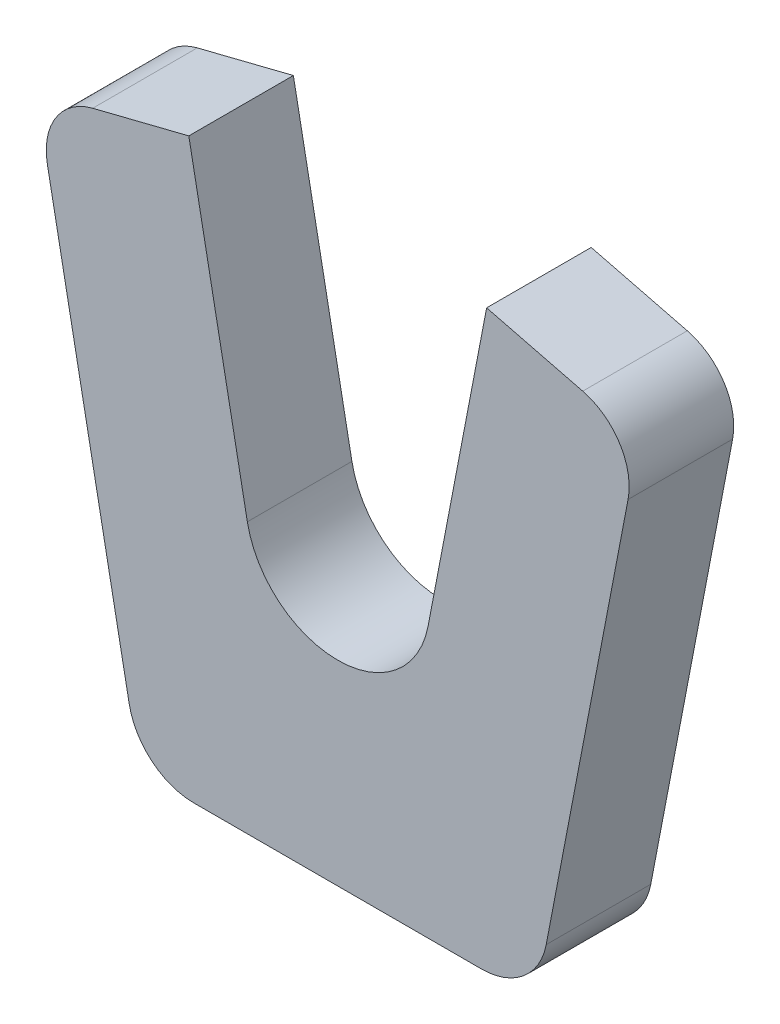
ISO-10303-21;
HEADER;
FILE_DESCRIPTION(('STEP AP214'),'2;1');
FILE_NAME('part.step','',(''),(''),'','','');
FILE_SCHEMA(('AUTOMOTIVE_DESIGN { 1 0 10303 214 1 1 1 1 }'));
ENDSEC;
DATA;
#1=APPLICATION_CONTEXT('core data for automotive mechanical design processes');
#2=APPLICATION_PROTOCOL_DEFINITION('international standard','automotive_design',2000,#1);
#3=PRODUCT_CONTEXT('',#1,'mechanical');
#4=PRODUCT('Part','Part','',(#3));
#5=PRODUCT_RELATED_PRODUCT_CATEGORY('part','',(#4));
#6=PRODUCT_DEFINITION_FORMATION('','',#4);
#7=PRODUCT_DEFINITION_CONTEXT('part definition',#1,'design');
#8=PRODUCT_DEFINITION('design','',#6,#7);
#9=PRODUCT_DEFINITION_SHAPE('','',#8);
#10=(LENGTH_UNIT() NAMED_UNIT(*) SI_UNIT(.MILLI.,.METRE.));
#11=(NAMED_UNIT(*) PLANE_ANGLE_UNIT() SI_UNIT($,.RADIAN.));
#12=(NAMED_UNIT(*) SI_UNIT($,.STERADIAN.) SOLID_ANGLE_UNIT());
#13=UNCERTAINTY_MEASURE_WITH_UNIT(LENGTH_MEASURE(1.E-05),#10,'distance_accuracy_value','');
#14=(GEOMETRIC_REPRESENTATION_CONTEXT(3) GLOBAL_UNCERTAINTY_ASSIGNED_CONTEXT((#13)) GLOBAL_UNIT_ASSIGNED_CONTEXT((#10,
#11,#12)) REPRESENTATION_CONTEXT('',''));
#15=CARTESIAN_POINT('',(0.,0.,0.));
#16=DIRECTION('',(0.,0.,1.));
#17=DIRECTION('',(1.,0.,0.));
#18=AXIS2_PLACEMENT_3D('',#15,#16,#17);
#19=CARTESIAN_POINT('',(13.75,6.3,10.));
#20=DIRECTION('',(0.,0.,-1.));
#21=DIRECTION('',(-1.,0.,0.));
#22=AXIS2_PLACEMENT_3D('',#19,#20,#21);
#23=CYLINDRICAL_SURFACE('',#22,6.3);
#24=CARTESIAN_POINT('',(13.75,6.3,0.));
#25=DIRECTION('',(0.,0.,1.));
#26=DIRECTION('',(1.,0.,0.));
#27=AXIS2_PLACEMENT_3D('',#24,#25,#26);
#28=CIRCLE('',#27,6.3);
#29=CARTESIAN_POINT('',(13.75,0.,0.));
#30=VERTEX_POINT('',#29);
#31=CARTESIAN_POINT('',(19.937041963821,5.1123503303084,0.));
#32=VERTEX_POINT('',#31);
#33=EDGE_CURVE('E156',#30,#32,#28,.T.);
#34=ORIENTED_EDGE('',*,*,#33,.T.);
#35=DIRECTION('',(0.,0.,-1.));
#36=VECTOR('',#35,1.);
#37=CARTESIAN_POINT('',(19.937041963821,5.1123503303084,10.));
#38=LINE('',#37,#36);
#39=CARTESIAN_POINT('',(19.937041963821,5.1123503303084,10.));
#40=VERTEX_POINT('',#39);
#41=EDGE_CURVE('E11',#40,#32,#38,.T.);
#42=ORIENTED_EDGE('',*,*,#41,.F.);
#43=CARTESIAN_POINT('',(13.75,6.3,10.));
#44=DIRECTION('',(0.,0.,1.));
#45=DIRECTION('',(1.,0.,0.));
#46=AXIS2_PLACEMENT_3D('',#43,#44,#45);
#47=CIRCLE('',#46,6.3);
#48=CARTESIAN_POINT('',(13.75,0.,10.));
#49=VERTEX_POINT('',#48);
#50=EDGE_CURVE('E178',#49,#40,#47,.T.);
#51=ORIENTED_EDGE('',*,*,#50,.F.);
#52=DIRECTION('',(0.,0.,-1.));
#53=VECTOR('',#52,1.);
#54=CARTESIAN_POINT('',(13.75,0.,10.));
#55=LINE('',#54,#53);
#56=EDGE_CURVE('E152',#49,#30,#55,.T.);
#57=ORIENTED_EDGE('',*,*,#56,.T.);
#58=EDGE_LOOP('',(#34,#42,#51,#57));
#59=FACE_BOUND('',#58,.T.);
#60=ADVANCED_FACE('F36',(#59),#23,.T.);
#61=CARTESIAN_POINT('',(19.937041963821,5.1123503303084,10.));
#62=DIRECTION('',(-0.982070152987453,0.188515820585968,0.));
#63=DIRECTION('',(-0.188515820585968,-0.982070152987453,0.));
#64=AXIS2_PLACEMENT_3D('',#61,#62,#63);
#65=PLANE('',#64);
#66=DIRECTION('',(0.188515820585968,0.982070152987453,0.));
#67=VECTOR('',#66,1.);
#68=CARTESIAN_POINT('',(19.937041963821,5.1123503303084,0.));
#69=LINE('',#68,#67);
#70=CARTESIAN_POINT('',(27.7652576974344,45.8933150219307,0.));
#71=VERTEX_POINT('',#70);
#72=EDGE_CURVE('E159',#32,#71,#69,.T.);
#73=ORIENTED_EDGE('',*,*,#72,.T.);
#74=DIRECTION('',(0.,0.,-1.));
#75=VECTOR('',#74,1.);
#76=CARTESIAN_POINT('',(27.7652576974344,45.8933150219307,10.));
#77=LINE('',#76,#75);
#78=CARTESIAN_POINT('',(27.7652576974344,45.8933150219307,10.));
#79=VERTEX_POINT('',#78);
#80=EDGE_CURVE('E44',#79,#71,#77,.T.);
#81=ORIENTED_EDGE('',*,*,#80,.F.);
#82=DIRECTION('',(0.188515820585968,0.982070152987453,0.));
#83=VECTOR('',#82,1.);
#84=CARTESIAN_POINT('',(19.937041963821,5.1123503303084,10.));
#85=LINE('',#84,#83);
#86=EDGE_CURVE('E107',#40,#79,#85,.T.);
#87=ORIENTED_EDGE('',*,*,#86,.F.);
#88=ORIENTED_EDGE('',*,*,#41,.T.);
#89=EDGE_LOOP('',(#73,#81,#87,#88));
#90=FACE_BOUND('',#89,.T.);
#91=ADVANCED_FACE('F256',(#90),#65,.F.);
#92=CARTESIAN_POINT('',(22.,47.,10.));
#93=DIRECTION('',(0.,0.,-1.));
#94=DIRECTION('',(-1.,0.,0.));
#95=AXIS2_PLACEMENT_3D('',#92,#93,#94);
#96=CYLINDRICAL_SURFACE('',#95,5.8705151357024);
#97=CARTESIAN_POINT('',(22.,47.,0.));
#98=DIRECTION('',(0.,0.,1.));
#99=DIRECTION('',(1.,0.,0.));
#100=AXIS2_PLACEMENT_3D('',#97,#98,#99);
#101=CIRCLE('',#100,5.8705151357024);
#102=CARTESIAN_POINT('',(23.4288752277412,52.6939672937293,0.));
#103=VERTEX_POINT('',#102);
#104=EDGE_CURVE('E161',#71,#103,#101,.T.);
#105=ORIENTED_EDGE('',*,*,#104,.T.);
#106=DIRECTION('',(0.,0.,-1.));
#107=VECTOR('',#106,1.);
#108=CARTESIAN_POINT('',(23.4288752277412,52.6939672937293,10.));
#109=LINE('',#108,#107);
#110=CARTESIAN_POINT('',(23.4288752277412,52.6939672937293,10.));
#111=VERTEX_POINT('',#110);
#112=EDGE_CURVE('E197',#111,#103,#109,.T.);
#113=ORIENTED_EDGE('',*,*,#112,.F.);
#114=CARTESIAN_POINT('',(22.,47.,10.));
#115=DIRECTION('',(0.,0.,1.));
#116=DIRECTION('',(1.,0.,0.));
#117=AXIS2_PLACEMENT_3D('',#114,#115,#116);
#118=CIRCLE('',#117,5.8705151357024);
#119=EDGE_CURVE('E205',#79,#111,#118,.T.);
#120=ORIENTED_EDGE('',*,*,#119,.F.);
#121=ORIENTED_EDGE('',*,*,#80,.T.);
#122=EDGE_LOOP('',(#105,#113,#120,#121));
#123=FACE_BOUND('',#122,.T.);
#124=ADVANCED_FACE('F203',(#123),#96,.T.);
#125=CARTESIAN_POINT('',(23.4288752277412,52.6939672937293,10.));
#126=DIRECTION('',(-0.243398610634918,-0.969926345833018,0.));
#127=DIRECTION('',(0.969926345833018,-0.243398610634918,0.));
#128=AXIS2_PLACEMENT_3D('',#125,#126,#127);
#129=PLANE('',#128);
#130=DIRECTION('',(-0.969926345833018,0.243398610634918,0.));
#131=VECTOR('',#130,1.);
#132=CARTESIAN_POINT('',(23.4288752277412,52.6939672937293,0.));
#133=LINE('',#132,#131);
#134=CARTESIAN_POINT('',(14.2394970701169,55.,0.));
#135=VERTEX_POINT('',#134);
#136=EDGE_CURVE('E163',#103,#135,#133,.T.);
#137=ORIENTED_EDGE('',*,*,#136,.T.);
#138=DIRECTION('',(0.,0.,-1.));
#139=VECTOR('',#138,1.);
#140=CARTESIAN_POINT('',(14.2394970701169,55.,10.));
#141=LINE('',#140,#139);
#142=CARTESIAN_POINT('',(14.2394970701169,55.,10.));
#143=VERTEX_POINT('',#142);
#144=EDGE_CURVE('E194',#143,#135,#141,.T.);
#145=ORIENTED_EDGE('',*,*,#144,.F.);
#146=DIRECTION('',(-0.969926345833018,0.243398610634918,0.));
#147=VECTOR('',#146,1.);
#148=CARTESIAN_POINT('',(23.4288752277412,52.6939672937293,10.));
#149=LINE('',#148,#147);
#150=EDGE_CURVE('E223',#111,#143,#149,.T.);
#151=ORIENTED_EDGE('',*,*,#150,.F.);
#152=ORIENTED_EDGE('',*,*,#112,.T.);
#153=EDGE_LOOP('',(#137,#145,#151,#152));
#154=FACE_BOUND('',#153,.T.);
#155=ADVANCED_FACE('F214',(#154),#129,.F.);
#156=CARTESIAN_POINT('',(14.2394970701169,55.,10.));
#157=DIRECTION('',(0.982070152987453,-0.188515820585968,0.));
#158=DIRECTION('',(0.188515820585968,0.982070152987453,0.));
#159=AXIS2_PLACEMENT_3D('',#156,#157,#158);
#160=PLANE('',#159);
#161=DIRECTION('',(-0.188515820585968,-0.982070152987453,0.));
#162=VECTOR('',#161,1.);
#163=CARTESIAN_POINT('',(14.2394970701169,55.,0.));
#164=LINE('',#163,#162);
#165=CARTESIAN_POINT('',(8.64221734628958,25.8410607788435,0.));
#166=VERTEX_POINT('',#165);
#167=EDGE_CURVE('E165',#135,#166,#164,.T.);
#168=ORIENTED_EDGE('',*,*,#167,.T.);
#169=DIRECTION('',(0.,0.,-1.));
#170=VECTOR('',#169,1.);
#171=CARTESIAN_POINT('',(8.64221734628958,25.8410607788435,10.));
#172=LINE('',#171,#170);
#173=CARTESIAN_POINT('',(8.64221734628958,25.8410607788435,10.));
#174=VERTEX_POINT('',#173);
#175=EDGE_CURVE('E191',#174,#166,#172,.T.);
#176=ORIENTED_EDGE('',*,*,#175,.F.);
#177=DIRECTION('',(-0.188515820585968,-0.982070152987453,0.));
#178=VECTOR('',#177,1.);
#179=CARTESIAN_POINT('',(14.2394970701169,55.,10.));
#180=LINE('',#179,#178);
#181=EDGE_CURVE('E220',#143,#174,#180,.T.);
#182=ORIENTED_EDGE('',*,*,#181,.F.);
#183=ORIENTED_EDGE('',*,*,#144,.T.);
#184=EDGE_LOOP('',(#168,#176,#182,#183));
#185=FACE_BOUND('',#184,.T.);
#186=ADVANCED_FACE('F218',(#185),#160,.F.);
#187=CARTESIAN_POINT('',(0.,27.5,10.));
#188=DIRECTION('',(0.,0.,-1.));
#189=DIRECTION('',(-1.,0.,0.));
#190=AXIS2_PLACEMENT_3D('',#187,#188,#189);
#191=CYLINDRICAL_SURFACE('',#190,8.8);
#192=CARTESIAN_POINT('',(0.,27.5,0.));
#193=DIRECTION('',(0.,0.,-1.));
#194=DIRECTION('',(1.,0.,0.));
#195=AXIS2_PLACEMENT_3D('',#192,#193,#194);
#196=CIRCLE('',#195,8.8);
#197=CARTESIAN_POINT('',(-8.64221734628958,25.8410607788435,0.));
#198=VERTEX_POINT('',#197);
#199=EDGE_CURVE('E167',#166,#198,#196,.T.);
#200=ORIENTED_EDGE('',*,*,#199,.T.);
#201=DIRECTION('',(0.,0.,-1.));
#202=VECTOR('',#201,1.);
#203=CARTESIAN_POINT('',(-8.64221734628958,25.8410607788435,10.));
#204=LINE('',#203,#202);
#205=CARTESIAN_POINT('',(-8.64221734628958,25.8410607788435,10.));
#206=VERTEX_POINT('',#205);
#207=EDGE_CURVE('E188',#206,#198,#204,.T.);
#208=ORIENTED_EDGE('',*,*,#207,.F.);
#209=CARTESIAN_POINT('',(0.,27.5,10.));
#210=DIRECTION('',(0.,0.,-1.));
#211=DIRECTION('',(1.,0.,0.));
#212=AXIS2_PLACEMENT_3D('',#209,#210,#211);
#213=CIRCLE('',#212,8.8);
#214=EDGE_CURVE('E222',#174,#206,#213,.T.);
#215=ORIENTED_EDGE('',*,*,#214,.F.);
#216=ORIENTED_EDGE('',*,*,#175,.T.);
#217=EDGE_LOOP('',(#200,#208,#215,#216));
#218=FACE_BOUND('',#217,.T.);
#219=ADVANCED_FACE('F269',(#218),#191,.F.);
#220=CARTESIAN_POINT('',(-14.2394970701169,55.,10.));
#221=DIRECTION('',(-0.982070152987453,-0.188515820585968,0.));
#222=DIRECTION('',(0.188515820585968,-0.982070152987453,0.));
#223=AXIS2_PLACEMENT_3D('',#220,#221,#222);
#224=PLANE('',#223);
#225=DIRECTION('',(-0.188515820585968,0.982070152987453,0.));
#226=VECTOR('',#225,1.);
#227=CARTESIAN_POINT('',(-14.2394970701169,55.,0.));
#228=LINE('',#227,#226);
#229=CARTESIAN_POINT('',(-14.2394970701169,55.,0.));
#230=VERTEX_POINT('',#229);
#231=EDGE_CURVE('E169',#198,#230,#228,.T.);
#232=ORIENTED_EDGE('',*,*,#231,.T.);
#233=DIRECTION('',(0.,0.,-1.));
#234=VECTOR('',#233,1.);
#235=CARTESIAN_POINT('',(-14.2394970701169,55.,10.));
#236=LINE('',#235,#234);
#237=CARTESIAN_POINT('',(-14.2394970701169,55.,10.));
#238=VERTEX_POINT('',#237);
#239=EDGE_CURVE('E185',#238,#230,#236,.T.);
#240=ORIENTED_EDGE('',*,*,#239,.F.);
#241=DIRECTION('',(-0.188515820585968,0.982070152987453,0.));
#242=VECTOR('',#241,1.);
#243=CARTESIAN_POINT('',(-14.2394970701169,55.,10.));
#244=LINE('',#243,#242);
#245=EDGE_CURVE('E225',#206,#238,#244,.T.);
#246=ORIENTED_EDGE('',*,*,#245,.F.);
#247=ORIENTED_EDGE('',*,*,#207,.T.);
#248=EDGE_LOOP('',(#232,#240,#246,#247));
#249=FACE_BOUND('',#248,.T.);
#250=ADVANCED_FACE('F272',(#249),#224,.F.);
#251=CARTESIAN_POINT('',(-23.4288752277412,52.6939672937293,10.));
#252=DIRECTION('',(0.243398610634918,-0.969926345833018,0.));
#253=DIRECTION('',(0.969926345833018,0.243398610634918,0.));
#254=AXIS2_PLACEMENT_3D('',#251,#252,#253);
#255=PLANE('',#254);
#256=DIRECTION('',(-0.969926345833018,-0.243398610634918,0.));
#257=VECTOR('',#256,1.);
#258=CARTESIAN_POINT('',(-23.4288752277412,52.6939672937293,0.));
#259=LINE('',#258,#257);
#260=CARTESIAN_POINT('',(-23.4288752277412,52.6939672937293,0.));
#261=VERTEX_POINT('',#260);
#262=EDGE_CURVE('E171',#230,#261,#259,.T.);
#263=ORIENTED_EDGE('',*,*,#262,.T.);
#264=DIRECTION('',(0.,0.,-1.));
#265=VECTOR('',#264,1.);
#266=CARTESIAN_POINT('',(-23.4288752277412,52.6939672937293,10.));
#267=LINE('',#266,#265);
#268=CARTESIAN_POINT('',(-23.4288752277412,52.6939672937293,10.));
#269=VERTEX_POINT('',#268);
#270=EDGE_CURVE('E182',#269,#261,#267,.T.);
#271=ORIENTED_EDGE('',*,*,#270,.F.);
#272=DIRECTION('',(-0.969926345833018,-0.243398610634918,0.));
#273=VECTOR('',#272,1.);
#274=CARTESIAN_POINT('',(-23.4288752277412,52.6939672937293,10.));
#275=LINE('',#274,#273);
#276=EDGE_CURVE('E231',#238,#269,#275,.T.);
#277=ORIENTED_EDGE('',*,*,#276,.F.);
#278=ORIENTED_EDGE('',*,*,#239,.T.);
#279=EDGE_LOOP('',(#263,#271,#277,#278));
#280=FACE_BOUND('',#279,.T.);
#281=ADVANCED_FACE('F237',(#280),#255,.F.);
#282=CARTESIAN_POINT('',(-22.,47.,10.));
#283=DIRECTION('',(0.,0.,-1.));
#284=DIRECTION('',(-1.,0.,0.));
#285=AXIS2_PLACEMENT_3D('',#282,#283,#284);
#286=CYLINDRICAL_SURFACE('',#285,5.8705151357024);
#287=CARTESIAN_POINT('',(-22.,47.,0.));
#288=DIRECTION('',(0.,0.,1.));
#289=DIRECTION('',(-1.,0.,0.));
#290=AXIS2_PLACEMENT_3D('',#287,#288,#289);
#291=CIRCLE('',#290,5.8705151357024);
#292=CARTESIAN_POINT('',(-27.7652576974344,45.8933150219307,0.));
#293=VERTEX_POINT('',#292);
#294=EDGE_CURVE('E173',#261,#293,#291,.T.);
#295=ORIENTED_EDGE('',*,*,#294,.T.);
#296=DIRECTION('',(0.,0.,-1.));
#297=VECTOR('',#296,1.);
#298=CARTESIAN_POINT('',(-27.7652576974344,45.8933150219307,10.));
#299=LINE('',#298,#297);
#300=CARTESIAN_POINT('',(-27.7652576974344,45.8933150219307,10.));
#301=VERTEX_POINT('',#300);
#302=EDGE_CURVE('E147',#301,#293,#299,.T.);
#303=ORIENTED_EDGE('',*,*,#302,.F.);
#304=CARTESIAN_POINT('',(-22.,47.,10.));
#305=DIRECTION('',(0.,0.,1.));
#306=DIRECTION('',(-1.,0.,0.));
#307=AXIS2_PLACEMENT_3D('',#304,#305,#306);
#308=CIRCLE('',#307,5.8705151357024);
#309=EDGE_CURVE('E138',#269,#301,#308,.T.);
#310=ORIENTED_EDGE('',*,*,#309,.F.);
#311=ORIENTED_EDGE('',*,*,#270,.T.);
#312=EDGE_LOOP('',(#295,#303,#310,#311));
#313=FACE_BOUND('',#312,.T.);
#314=ADVANCED_FACE('F241',(#313),#286,.T.);
#315=CARTESIAN_POINT('',(-19.937041963821,5.1123503303084,10.));
#316=DIRECTION('',(0.982070152987453,0.188515820585968,0.));
#317=DIRECTION('',(-0.188515820585968,0.982070152987453,0.));
#318=AXIS2_PLACEMENT_3D('',#315,#316,#317);
#319=PLANE('',#318);
#320=DIRECTION('',(0.188515820585968,-0.982070152987453,0.));
#321=VECTOR('',#320,1.);
#322=CARTESIAN_POINT('',(-19.937041963821,5.1123503303084,0.));
#323=LINE('',#322,#321);
#324=CARTESIAN_POINT('',(-19.937041963821,5.1123503303084,0.));
#325=VERTEX_POINT('',#324);
#326=EDGE_CURVE('E146',#293,#325,#323,.T.);
#327=ORIENTED_EDGE('',*,*,#326,.T.);
#328=DIRECTION('',(0.,0.,-1.));
#329=VECTOR('',#328,1.);
#330=CARTESIAN_POINT('',(-19.937041963821,5.1123503303084,10.));
#331=LINE('',#330,#329);
#332=CARTESIAN_POINT('',(-19.937041963821,5.1123503303084,10.));
#333=VERTEX_POINT('',#332);
#334=EDGE_CURVE('E143',#333,#325,#331,.T.);
#335=ORIENTED_EDGE('',*,*,#334,.F.);
#336=DIRECTION('',(0.188515820585968,-0.982070152987453,0.));
#337=VECTOR('',#336,1.);
#338=CARTESIAN_POINT('',(-19.937041963821,5.1123503303084,10.));
#339=LINE('',#338,#337);
#340=EDGE_CURVE('E132',#301,#333,#339,.T.);
#341=ORIENTED_EDGE('',*,*,#340,.F.);
#342=ORIENTED_EDGE('',*,*,#302,.T.);
#343=EDGE_LOOP('',(#327,#335,#341,#342));
#344=FACE_BOUND('',#343,.T.);
#345=ADVANCED_FACE('F144',(#344),#319,.F.);
#346=CARTESIAN_POINT('',(-13.75,6.3,10.));
#347=DIRECTION('',(0.,0.,-1.));
#348=DIRECTION('',(-1.,0.,0.));
#349=AXIS2_PLACEMENT_3D('',#346,#347,#348);
#350=CYLINDRICAL_SURFACE('',#349,6.3);
#351=CARTESIAN_POINT('',(-13.75,6.3,0.));
#352=DIRECTION('',(0.,0.,1.));
#353=DIRECTION('',(-1.,0.,0.));
#354=AXIS2_PLACEMENT_3D('',#351,#352,#353);
#355=CIRCLE('',#354,6.3);
#356=CARTESIAN_POINT('',(-13.75,0.,0.));
#357=VERTEX_POINT('',#356);
#358=EDGE_CURVE('E93',#325,#357,#355,.T.);
#359=ORIENTED_EDGE('',*,*,#358,.T.);
#360=DIRECTION('',(0.,0.,-1.));
#361=VECTOR('',#360,1.);
#362=CARTESIAN_POINT('',(-13.75,0.,10.));
#363=LINE('',#362,#361);
#364=CARTESIAN_POINT('',(-13.75,0.,10.));
#365=VERTEX_POINT('',#364);
#366=EDGE_CURVE('E148',#365,#357,#363,.T.);
#367=ORIENTED_EDGE('',*,*,#366,.F.);
#368=CARTESIAN_POINT('',(-13.75,6.3,10.));
#369=DIRECTION('',(0.,0.,1.));
#370=DIRECTION('',(-1.,0.,0.));
#371=AXIS2_PLACEMENT_3D('',#368,#369,#370);
#372=CIRCLE('',#371,6.3);
#373=EDGE_CURVE('E136',#333,#365,#372,.T.);
#374=ORIENTED_EDGE('',*,*,#373,.F.);
#375=ORIENTED_EDGE('',*,*,#334,.T.);
#376=EDGE_LOOP('',(#359,#367,#374,#375));
#377=FACE_BOUND('',#376,.T.);
#378=ADVANCED_FACE('F150',(#377),#350,.T.);
#379=CARTESIAN_POINT('',(-13.75,0.,10.));
#380=DIRECTION('',(0.,1.,0.));
#381=DIRECTION('',(0.,0.,1.));
#382=AXIS2_PLACEMENT_3D('',#379,#380,#381);
#383=PLANE('',#382);
#384=DIRECTION('',(1.,0.,0.));
#385=VECTOR('',#384,1.);
#386=CARTESIAN_POINT('',(-13.75,0.,0.));
#387=LINE('',#386,#385);
#388=EDGE_CURVE('E99',#357,#30,#387,.T.);
#389=ORIENTED_EDGE('',*,*,#388,.T.);
#390=ORIENTED_EDGE('',*,*,#56,.F.);
#391=DIRECTION('',(1.,0.,0.));
#392=VECTOR('',#391,1.);
#393=CARTESIAN_POINT('',(-13.75,0.,10.));
#394=LINE('',#393,#392);
#395=EDGE_CURVE('E52',#365,#49,#394,.T.);
#396=ORIENTED_EDGE('',*,*,#395,.F.);
#397=ORIENTED_EDGE('',*,*,#366,.T.);
#398=EDGE_LOOP('',(#389,#390,#396,#397));
#399=FACE_BOUND('',#398,.T.);
#400=ADVANCED_FACE('F245',(#399),#383,.F.);
#401=CARTESIAN_POINT('',(13.75,6.3,10.));
#402=DIRECTION('',(0.,0.,1.));
#403=DIRECTION('',(1.,0.,0.));
#404=AXIS2_PLACEMENT_3D('',#401,#402,#403);
#405=PLANE('',#404);
#406=ORIENTED_EDGE('',*,*,#50,.T.);
#407=ORIENTED_EDGE('',*,*,#86,.T.);
#408=ORIENTED_EDGE('',*,*,#119,.T.);
#409=ORIENTED_EDGE('',*,*,#150,.T.);
#410=ORIENTED_EDGE('',*,*,#181,.T.);
#411=ORIENTED_EDGE('',*,*,#214,.T.);
#412=ORIENTED_EDGE('',*,*,#245,.T.);
#413=ORIENTED_EDGE('',*,*,#276,.T.);
#414=ORIENTED_EDGE('',*,*,#309,.T.);
#415=ORIENTED_EDGE('',*,*,#340,.T.);
#416=ORIENTED_EDGE('',*,*,#373,.T.);
#417=ORIENTED_EDGE('',*,*,#395,.T.);
#418=EDGE_LOOP('',(#406,#407,#408,#409,#410,#411,#412,#413,#414,#415,#416,#417));
#419=FACE_BOUND('',#418,.T.);
#420=ADVANCED_FACE('F134',(#419),#405,.T.);
#421=CARTESIAN_POINT('',(13.75,6.3,0.));
#422=DIRECTION('',(0.,0.,1.));
#423=DIRECTION('',(1.,0.,0.));
#424=AXIS2_PLACEMENT_3D('',#421,#422,#423);
#425=PLANE('',#424);
#426=ORIENTED_EDGE('',*,*,#33,.F.);
#427=ORIENTED_EDGE('',*,*,#388,.F.);
#428=ORIENTED_EDGE('',*,*,#358,.F.);
#429=ORIENTED_EDGE('',*,*,#326,.F.);
#430=ORIENTED_EDGE('',*,*,#294,.F.);
#431=ORIENTED_EDGE('',*,*,#262,.F.);
#432=ORIENTED_EDGE('',*,*,#231,.F.);
#433=ORIENTED_EDGE('',*,*,#199,.F.);
#434=ORIENTED_EDGE('',*,*,#167,.F.);
#435=ORIENTED_EDGE('',*,*,#136,.F.);
#436=ORIENTED_EDGE('',*,*,#104,.F.);
#437=ORIENTED_EDGE('',*,*,#72,.F.);
#438=EDGE_LOOP('',(#426,#427,#428,#429,#430,#431,#432,#433,#434,#435,#436,#437));
#439=FACE_BOUND('',#438,.T.);
#440=ADVANCED_FACE('F209',(#439),#425,.F.);
#441=CLOSED_SHELL('',(#60,#91,#124,#155,#186,#219,#250,#281,#314,#345,#378,#400,#420,#440));
#442=MANIFOLD_SOLID_BREP('B2',#441);
#443=ADVANCED_BREP_SHAPE_REPRESENTATION('',(#18,#442),#14);
#444=SHAPE_DEFINITION_REPRESENTATION(#9,#443);
ENDSEC;
END-ISO-10303-21;
